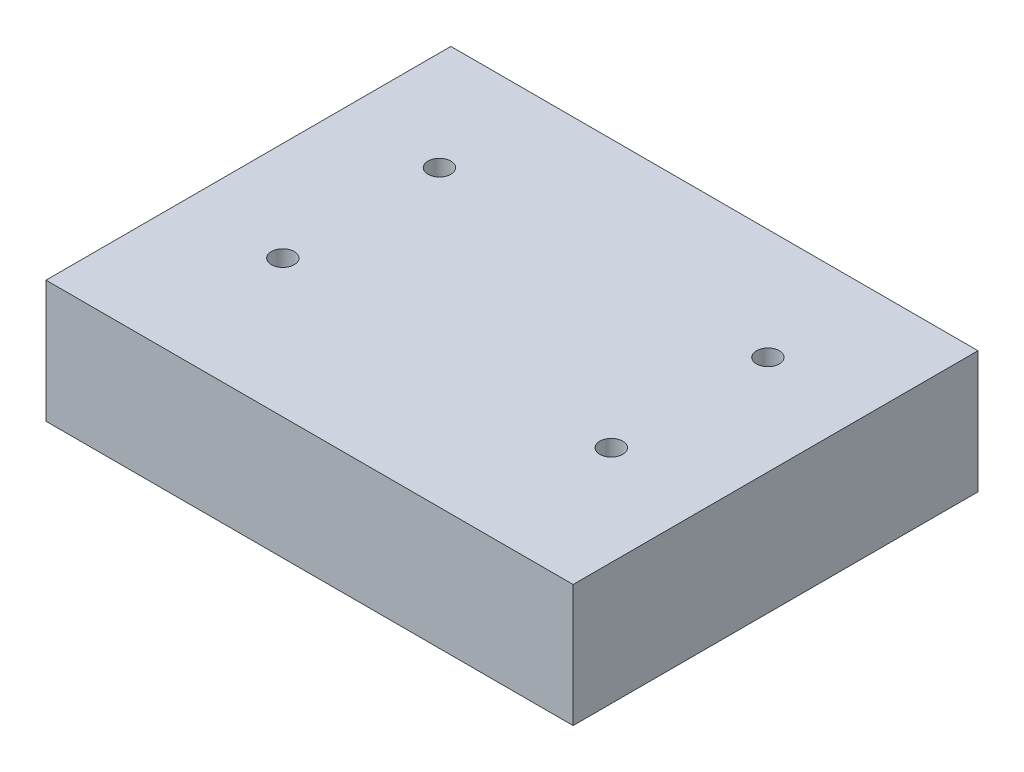
ISO-10303-21;
HEADER;
FILE_DESCRIPTION(('STEP AP214'),'2;1');
FILE_NAME('part.step','',(''),(''),'','','');
FILE_SCHEMA(('AUTOMOTIVE_DESIGN { 1 0 10303 214 1 1 1 1 }'));
ENDSEC;
DATA;
#1=APPLICATION_CONTEXT('core data for automotive mechanical design processes');
#2=APPLICATION_PROTOCOL_DEFINITION('international standard','automotive_design',2000,#1);
#3=PRODUCT_CONTEXT('',#1,'mechanical');
#4=PRODUCT('Part','Part','',(#3));
#5=PRODUCT_RELATED_PRODUCT_CATEGORY('part','',(#4));
#6=PRODUCT_DEFINITION_FORMATION('','',#4);
#7=PRODUCT_DEFINITION_CONTEXT('part definition',#1,'design');
#8=PRODUCT_DEFINITION('design','',#6,#7);
#9=PRODUCT_DEFINITION_SHAPE('','',#8);
#10=(LENGTH_UNIT() NAMED_UNIT(*) SI_UNIT(.MILLI.,.METRE.));
#11=(NAMED_UNIT(*) PLANE_ANGLE_UNIT() SI_UNIT($,.RADIAN.));
#12=(NAMED_UNIT(*) SI_UNIT($,.STERADIAN.) SOLID_ANGLE_UNIT());
#13=UNCERTAINTY_MEASURE_WITH_UNIT(LENGTH_MEASURE(1.E-05),#10,'distance_accuracy_value','');
#14=(GEOMETRIC_REPRESENTATION_CONTEXT(3) GLOBAL_UNCERTAINTY_ASSIGNED_CONTEXT((#13)) GLOBAL_UNIT_ASSIGNED_CONTEXT((#10,
#11,#12)) REPRESENTATION_CONTEXT('',''));
#15=CARTESIAN_POINT('',(0.,0.,0.));
#16=DIRECTION('',(0.,0.,1.));
#17=DIRECTION('',(1.,0.,0.));
#18=AXIS2_PLACEMENT_3D('',#15,#16,#17);
#19=CARTESIAN_POINT('',(0.,800.,0.));
#20=DIRECTION('',(0.,1.,0.));
#21=DIRECTION('',(0.,0.,1.));
#22=AXIS2_PLACEMENT_3D('',#19,#20,#21);
#23=PLANE('',#22);
#24=CARTESIAN_POINT('',(-1075.,800.,425.));
#25=DIRECTION('',(0.,1.,0.));
#26=DIRECTION('',(0.,0.,-1.));
#27=AXIS2_PLACEMENT_3D('',#24,#25,#26);
#28=CIRCLE('',#27,75.);
#29=CARTESIAN_POINT('',(-1075.,800.,350.));
#30=VERTEX_POINT('',#29);
#31=EDGE_CURVE('E131',#30,#30,#28,.T.);
#32=ORIENTED_EDGE('',*,*,#31,.F.);
#33=EDGE_LOOP('',(#32));
#34=FACE_BOUND('',#33,.T.);
#35=CARTESIAN_POINT('',(1075.,800.,425.));
#36=DIRECTION('',(0.,1.,0.));
#37=DIRECTION('',(0.,0.,1.));
#38=AXIS2_PLACEMENT_3D('',#35,#36,#37);
#39=CIRCLE('',#38,75.);
#40=CARTESIAN_POINT('',(1075.,800.,500.));
#41=VERTEX_POINT('',#40);
#42=EDGE_CURVE('E110',#41,#41,#39,.T.);
#43=ORIENTED_EDGE('',*,*,#42,.F.);
#44=EDGE_LOOP('',(#43));
#45=FACE_BOUND('',#44,.T.);
#46=DIRECTION('',(0.,0.,1.));
#47=VECTOR('',#46,1.);
#48=CARTESIAN_POINT('',(-1725.,800.,1325.));
#49=LINE('',#48,#47);
#50=CARTESIAN_POINT('',(-1725.,800.,-1325.));
#51=VERTEX_POINT('',#50);
#52=CARTESIAN_POINT('',(-1725.,800.,1325.));
#53=VERTEX_POINT('',#52);
#54=EDGE_CURVE('E95',#51,#53,#49,.T.);
#55=ORIENTED_EDGE('',*,*,#54,.T.);
#56=DIRECTION('',(1.,0.,0.));
#57=VECTOR('',#56,1.);
#58=CARTESIAN_POINT('',(1725.,800.,1325.));
#59=LINE('',#58,#57);
#60=CARTESIAN_POINT('',(1725.,800.,1325.));
#61=VERTEX_POINT('',#60);
#62=EDGE_CURVE('E90',#53,#61,#59,.T.);
#63=ORIENTED_EDGE('',*,*,#62,.T.);
#64=DIRECTION('',(0.,0.,-1.));
#65=VECTOR('',#64,1.);
#66=CARTESIAN_POINT('',(1725.,800.,1325.));
#67=LINE('',#66,#65);
#68=CARTESIAN_POINT('',(1725.,800.,-1325.));
#69=VERTEX_POINT('',#68);
#70=EDGE_CURVE('E93',#61,#69,#67,.T.);
#71=ORIENTED_EDGE('',*,*,#70,.T.);
#72=DIRECTION('',(-1.,0.,0.));
#73=VECTOR('',#72,1.);
#74=CARTESIAN_POINT('',(1725.,800.,-1325.));
#75=LINE('',#74,#73);
#76=EDGE_CURVE('E60',#69,#51,#75,.T.);
#77=ORIENTED_EDGE('',*,*,#76,.T.);
#78=EDGE_LOOP('',(#55,#63,#71,#77));
#79=FACE_BOUND('',#78,.T.);
#80=CARTESIAN_POINT('',(1075.,800.,-600.));
#81=DIRECTION('',(0.,1.,0.));
#82=DIRECTION('',(0.,0.,1.));
#83=AXIS2_PLACEMENT_3D('',#80,#81,#82);
#84=CIRCLE('',#83,75.);
#85=CARTESIAN_POINT('',(1075.,800.,-525.));
#86=VERTEX_POINT('',#85);
#87=EDGE_CURVE('E125',#86,#86,#84,.T.);
#88=ORIENTED_EDGE('',*,*,#87,.F.);
#89=EDGE_LOOP('',(#88));
#90=FACE_BOUND('',#89,.T.);
#91=CARTESIAN_POINT('',(-1075.,800.,-600.));
#92=DIRECTION('',(0.,1.,0.));
#93=DIRECTION('',(0.,0.,-1.));
#94=AXIS2_PLACEMENT_3D('',#91,#92,#93);
#95=CIRCLE('',#94,75.);
#96=CARTESIAN_POINT('',(-1075.,800.,-675.));
#97=VERTEX_POINT('',#96);
#98=EDGE_CURVE('E137',#97,#97,#95,.T.);
#99=ORIENTED_EDGE('',*,*,#98,.F.);
#100=EDGE_LOOP('',(#99));
#101=FACE_BOUND('',#100,.T.);
#102=ADVANCED_FACE('F43',(#34,#45,#79,#90,#101),#23,.T.);
#103=CARTESIAN_POINT('',(0.,0.,0.));
#104=DIRECTION('',(0.,1.,0.));
#105=DIRECTION('',(0.,0.,1.));
#106=AXIS2_PLACEMENT_3D('',#103,#104,#105);
#107=PLANE('',#106);
#108=DIRECTION('',(0.,0.,1.));
#109=VECTOR('',#108,1.);
#110=CARTESIAN_POINT('',(-1725.,0.,1325.));
#111=LINE('',#110,#109);
#112=CARTESIAN_POINT('',(-1725.,0.,-1325.));
#113=VERTEX_POINT('',#112);
#114=CARTESIAN_POINT('',(-1725.,0.,1325.));
#115=VERTEX_POINT('',#114);
#116=EDGE_CURVE('E107',#113,#115,#111,.T.);
#117=ORIENTED_EDGE('',*,*,#116,.F.);
#118=DIRECTION('',(-1.,0.,0.));
#119=VECTOR('',#118,1.);
#120=CARTESIAN_POINT('',(1725.,0.,-1325.));
#121=LINE('',#120,#119);
#122=CARTESIAN_POINT('',(1725.,0.,-1325.));
#123=VERTEX_POINT('',#122);
#124=EDGE_CURVE('E83',#123,#113,#121,.T.);
#125=ORIENTED_EDGE('',*,*,#124,.F.);
#126=DIRECTION('',(0.,0.,-1.));
#127=VECTOR('',#126,1.);
#128=CARTESIAN_POINT('',(1725.,0.,1325.));
#129=LINE('',#128,#127);
#130=CARTESIAN_POINT('',(1725.,0.,1325.));
#131=VERTEX_POINT('',#130);
#132=EDGE_CURVE('E77',#131,#123,#129,.T.);
#133=ORIENTED_EDGE('',*,*,#132,.F.);
#134=DIRECTION('',(1.,0.,0.));
#135=VECTOR('',#134,1.);
#136=CARTESIAN_POINT('',(1725.,0.,1325.));
#137=LINE('',#136,#135);
#138=EDGE_CURVE('E99',#115,#131,#137,.T.);
#139=ORIENTED_EDGE('',*,*,#138,.F.);
#140=EDGE_LOOP('',(#117,#125,#133,#139));
#141=FACE_BOUND('',#140,.T.);
#142=CARTESIAN_POINT('',(1075.,0.,425.));
#143=DIRECTION('',(0.,1.,0.));
#144=DIRECTION('',(0.,0.,1.));
#145=AXIS2_PLACEMENT_3D('',#142,#143,#144);
#146=CIRCLE('',#145,75.);
#147=CARTESIAN_POINT('',(1075.,0.,500.));
#148=VERTEX_POINT('',#147);
#149=EDGE_CURVE('E122',#148,#148,#146,.T.);
#150=ORIENTED_EDGE('',*,*,#149,.T.);
#151=EDGE_LOOP('',(#150));
#152=FACE_BOUND('',#151,.T.);
#153=CARTESIAN_POINT('',(1075.,0.,-600.));
#154=DIRECTION('',(0.,1.,0.));
#155=DIRECTION('',(0.,0.,1.));
#156=AXIS2_PLACEMENT_3D('',#153,#154,#155);
#157=CIRCLE('',#156,75.);
#158=CARTESIAN_POINT('',(1075.,0.,-525.));
#159=VERTEX_POINT('',#158);
#160=EDGE_CURVE('E128',#159,#159,#157,.T.);
#161=ORIENTED_EDGE('',*,*,#160,.T.);
#162=EDGE_LOOP('',(#161));
#163=FACE_BOUND('',#162,.T.);
#164=CARTESIAN_POINT('',(-1075.,0.,425.));
#165=DIRECTION('',(0.,1.,0.));
#166=DIRECTION('',(0.,0.,-1.));
#167=AXIS2_PLACEMENT_3D('',#164,#165,#166);
#168=CIRCLE('',#167,75.);
#169=CARTESIAN_POINT('',(-1075.,0.,350.));
#170=VERTEX_POINT('',#169);
#171=EDGE_CURVE('E134',#170,#170,#168,.T.);
#172=ORIENTED_EDGE('',*,*,#171,.T.);
#173=EDGE_LOOP('',(#172));
#174=FACE_BOUND('',#173,.T.);
#175=CARTESIAN_POINT('',(-1075.,0.,-600.));
#176=DIRECTION('',(0.,1.,0.));
#177=DIRECTION('',(0.,0.,-1.));
#178=AXIS2_PLACEMENT_3D('',#175,#176,#177);
#179=CIRCLE('',#178,75.);
#180=CARTESIAN_POINT('',(-1075.,0.,-675.));
#181=VERTEX_POINT('',#180);
#182=EDGE_CURVE('E140',#181,#181,#179,.T.);
#183=ORIENTED_EDGE('',*,*,#182,.T.);
#184=EDGE_LOOP('',(#183));
#185=FACE_BOUND('',#184,.T.);
#186=ADVANCED_FACE('F118',(#141,#152,#163,#174,#185),#107,.F.);
#187=CARTESIAN_POINT('',(-1725.,800.,1325.));
#188=DIRECTION('',(1.,0.,0.));
#189=DIRECTION('',(0.,0.,-1.));
#190=AXIS2_PLACEMENT_3D('',#187,#188,#189);
#191=PLANE('',#190);
#192=ORIENTED_EDGE('',*,*,#116,.T.);
#193=DIRECTION('',(0.,-1.,0.));
#194=VECTOR('',#193,1.);
#195=CARTESIAN_POINT('',(-1725.,800.,1325.));
#196=LINE('',#195,#194);
#197=EDGE_CURVE('E11',#53,#115,#196,.T.);
#198=ORIENTED_EDGE('',*,*,#197,.F.);
#199=ORIENTED_EDGE('',*,*,#54,.F.);
#200=DIRECTION('',(0.,-1.,0.));
#201=VECTOR('',#200,1.);
#202=CARTESIAN_POINT('',(-1725.,800.,-1325.));
#203=LINE('',#202,#201);
#204=EDGE_CURVE('E103',#51,#113,#203,.T.);
#205=ORIENTED_EDGE('',*,*,#204,.T.);
#206=EDGE_LOOP('',(#192,#198,#199,#205));
#207=FACE_BOUND('',#206,.T.);
#208=ADVANCED_FACE('F45',(#207),#191,.F.);
#209=CARTESIAN_POINT('',(1725.,800.,1325.));
#210=DIRECTION('',(0.,0.,-1.));
#211=DIRECTION('',(-1.,0.,0.));
#212=AXIS2_PLACEMENT_3D('',#209,#210,#211);
#213=PLANE('',#212);
#214=ORIENTED_EDGE('',*,*,#138,.T.);
#215=DIRECTION('',(0.,-1.,0.));
#216=VECTOR('',#215,1.);
#217=CARTESIAN_POINT('',(1725.,800.,1325.));
#218=LINE('',#217,#216);
#219=EDGE_CURVE('E52',#61,#131,#218,.T.);
#220=ORIENTED_EDGE('',*,*,#219,.F.);
#221=ORIENTED_EDGE('',*,*,#62,.F.);
#222=ORIENTED_EDGE('',*,*,#197,.T.);
#223=EDGE_LOOP('',(#214,#220,#221,#222));
#224=FACE_BOUND('',#223,.T.);
#225=ADVANCED_FACE('F98',(#224),#213,.F.);
#226=CARTESIAN_POINT('',(1725.,800.,1325.));
#227=DIRECTION('',(-1.,0.,0.));
#228=DIRECTION('',(0.,0.,1.));
#229=AXIS2_PLACEMENT_3D('',#226,#227,#228);
#230=PLANE('',#229);
#231=ORIENTED_EDGE('',*,*,#132,.T.);
#232=DIRECTION('',(0.,-1.,0.));
#233=VECTOR('',#232,1.);
#234=CARTESIAN_POINT('',(1725.,800.,-1325.));
#235=LINE('',#234,#233);
#236=EDGE_CURVE('E100',#69,#123,#235,.T.);
#237=ORIENTED_EDGE('',*,*,#236,.F.);
#238=ORIENTED_EDGE('',*,*,#70,.F.);
#239=ORIENTED_EDGE('',*,*,#219,.T.);
#240=EDGE_LOOP('',(#231,#237,#238,#239));
#241=FACE_BOUND('',#240,.T.);
#242=ADVANCED_FACE('F101',(#241),#230,.F.);
#243=CARTESIAN_POINT('',(1725.,800.,-1325.));
#244=DIRECTION('',(0.,0.,1.));
#245=DIRECTION('',(1.,0.,0.));
#246=AXIS2_PLACEMENT_3D('',#243,#244,#245);
#247=PLANE('',#246);
#248=ORIENTED_EDGE('',*,*,#124,.T.);
#249=ORIENTED_EDGE('',*,*,#204,.F.);
#250=ORIENTED_EDGE('',*,*,#76,.F.);
#251=ORIENTED_EDGE('',*,*,#236,.T.);
#252=EDGE_LOOP('',(#248,#249,#250,#251));
#253=FACE_BOUND('',#252,.T.);
#254=ADVANCED_FACE('F115',(#253),#247,.F.);
#255=CARTESIAN_POINT('',(1075.,800.,425.));
#256=DIRECTION('',(0.,-1.,0.));
#257=DIRECTION('',(0.,0.,-1.));
#258=AXIS2_PLACEMENT_3D('',#255,#256,#257);
#259=CYLINDRICAL_SURFACE('',#258,75.);
#260=ORIENTED_EDGE('',*,*,#42,.T.);
#261=EDGE_LOOP('',(#260));
#262=FACE_BOUND('',#261,.T.);
#263=ORIENTED_EDGE('',*,*,#149,.F.);
#264=EDGE_LOOP('',(#263));
#265=FACE_BOUND('',#264,.T.);
#266=ADVANCED_FACE('F159',(#262,#265),#259,.F.);
#267=CARTESIAN_POINT('',(1075.,800.,-600.));
#268=DIRECTION('',(0.,-1.,0.));
#269=DIRECTION('',(0.,0.,-1.));
#270=AXIS2_PLACEMENT_3D('',#267,#268,#269);
#271=CYLINDRICAL_SURFACE('',#270,75.);
#272=ORIENTED_EDGE('',*,*,#87,.T.);
#273=EDGE_LOOP('',(#272));
#274=FACE_BOUND('',#273,.T.);
#275=ORIENTED_EDGE('',*,*,#160,.F.);
#276=EDGE_LOOP('',(#275));
#277=FACE_BOUND('',#276,.T.);
#278=ADVANCED_FACE('F227',(#274,#277),#271,.F.);
#279=CARTESIAN_POINT('',(-1075.,800.,425.));
#280=DIRECTION('',(0.,-1.,0.));
#281=DIRECTION('',(0.,0.,-1.));
#282=AXIS2_PLACEMENT_3D('',#279,#280,#281);
#283=CYLINDRICAL_SURFACE('',#282,75.);
#284=ORIENTED_EDGE('',*,*,#31,.T.);
#285=EDGE_LOOP('',(#284));
#286=FACE_BOUND('',#285,.T.);
#287=ORIENTED_EDGE('',*,*,#171,.F.);
#288=EDGE_LOOP('',(#287));
#289=FACE_BOUND('',#288,.T.);
#290=ADVANCED_FACE('F238',(#286,#289),#283,.F.);
#291=CARTESIAN_POINT('',(-1075.,800.,-600.));
#292=DIRECTION('',(0.,-1.,0.));
#293=DIRECTION('',(0.,0.,-1.));
#294=AXIS2_PLACEMENT_3D('',#291,#292,#293);
#295=CYLINDRICAL_SURFACE('',#294,75.);
#296=ORIENTED_EDGE('',*,*,#98,.T.);
#297=EDGE_LOOP('',(#296));
#298=FACE_BOUND('',#297,.T.);
#299=ORIENTED_EDGE('',*,*,#182,.F.);
#300=EDGE_LOOP('',(#299));
#301=FACE_BOUND('',#300,.T.);
#302=ADVANCED_FACE('F146',(#298,#301),#295,.F.);
#303=CLOSED_SHELL('',(#102,#186,#208,#225,#242,#254,#266,#278,#290,#302));
#304=MANIFOLD_SOLID_BREP('B2',#303);
#305=ADVANCED_BREP_SHAPE_REPRESENTATION('',(#18,#304),#14);
#306=SHAPE_DEFINITION_REPRESENTATION(#9,#305);
ENDSEC;
END-ISO-10303-21;
